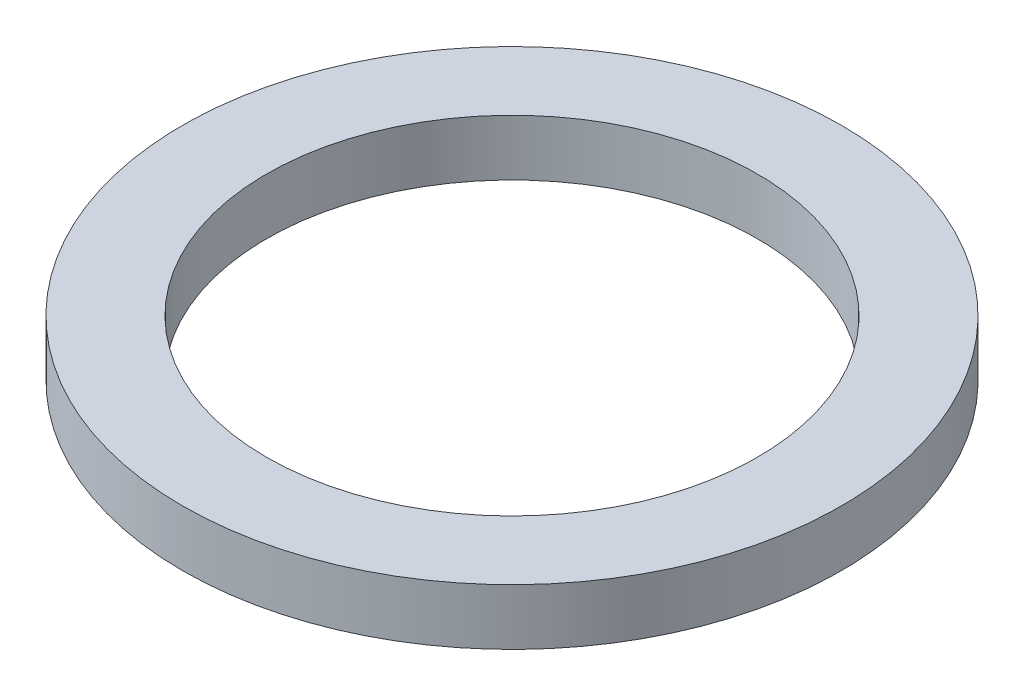
ISO-10303-21;
HEADER;
FILE_DESCRIPTION(('STEP AP214'),'2;1');
FILE_NAME('part.step','',(''),(''),'','','');
FILE_SCHEMA(('AUTOMOTIVE_DESIGN { 1 0 10303 214 1 1 1 1 }'));
ENDSEC;
DATA;
#1=APPLICATION_CONTEXT('core data for automotive mechanical design processes');
#2=APPLICATION_PROTOCOL_DEFINITION('international standard','automotive_design',2000,#1);
#3=PRODUCT_CONTEXT('',#1,'mechanical');
#4=PRODUCT('Part','Part','',(#3));
#5=PRODUCT_RELATED_PRODUCT_CATEGORY('part','',(#4));
#6=PRODUCT_DEFINITION_FORMATION('','',#4);
#7=PRODUCT_DEFINITION_CONTEXT('part definition',#1,'design');
#8=PRODUCT_DEFINITION('design','',#6,#7);
#9=PRODUCT_DEFINITION_SHAPE('','',#8);
#10=(LENGTH_UNIT() NAMED_UNIT(*) SI_UNIT(.MILLI.,.METRE.));
#11=(NAMED_UNIT(*) PLANE_ANGLE_UNIT() SI_UNIT($,.RADIAN.));
#12=(NAMED_UNIT(*) SI_UNIT($,.STERADIAN.) SOLID_ANGLE_UNIT());
#13=UNCERTAINTY_MEASURE_WITH_UNIT(LENGTH_MEASURE(1.E-05),#10,'distance_accuracy_value','');
#14=(GEOMETRIC_REPRESENTATION_CONTEXT(3) GLOBAL_UNCERTAINTY_ASSIGNED_CONTEXT((#13)) GLOBAL_UNIT_ASSIGNED_CONTEXT((#10,
#11,#12)) REPRESENTATION_CONTEXT('',''));
#15=CARTESIAN_POINT('',(0.,0.,0.));
#16=DIRECTION('',(0.,0.,1.));
#17=DIRECTION('',(1.,0.,0.));
#18=AXIS2_PLACEMENT_3D('',#15,#16,#17);
#19=CARTESIAN_POINT('',(0.,4.,0.));
#20=DIRECTION('',(0.,1.,0.));
#21=DIRECTION('',(0.,0.,1.));
#22=AXIS2_PLACEMENT_3D('',#19,#20,#21);
#23=PLANE('',#22);
#24=CARTESIAN_POINT('',(0.,4.,0.));
#25=DIRECTION('',(0.,1.,0.));
#26=DIRECTION('',(0.,0.,1.));
#27=AXIS2_PLACEMENT_3D('',#24,#25,#26);
#28=CIRCLE('',#27,23.5);
#29=CARTESIAN_POINT('',(0.,4.,23.5));
#30=VERTEX_POINT('',#29);
#31=EDGE_CURVE('E10',#30,#30,#28,.T.);
#32=ORIENTED_EDGE('',*,*,#31,.T.);
#33=EDGE_LOOP('',(#32));
#34=FACE_BOUND('',#33,.T.);
#35=CARTESIAN_POINT('',(0.,4.,0.));
#36=DIRECTION('',(0.,1.,0.));
#37=DIRECTION('',(0.,0.,1.));
#38=AXIS2_PLACEMENT_3D('',#35,#36,#37);
#39=CIRCLE('',#38,17.5);
#40=CARTESIAN_POINT('',(0.,4.,17.5));
#41=VERTEX_POINT('',#40);
#42=EDGE_CURVE('E44',#41,#41,#39,.T.);
#43=ORIENTED_EDGE('',*,*,#42,.F.);
#44=EDGE_LOOP('',(#43));
#45=FACE_BOUND('',#44,.T.);
#46=ADVANCED_FACE('F33',(#34,#45),#23,.T.);
#47=CARTESIAN_POINT('',(0.,0.,0.));
#48=DIRECTION('',(0.,1.,0.));
#49=DIRECTION('',(0.,0.,1.));
#50=AXIS2_PLACEMENT_3D('',#47,#48,#49);
#51=PLANE('',#50);
#52=CARTESIAN_POINT('',(0.,0.,0.));
#53=DIRECTION('',(0.,1.,0.));
#54=DIRECTION('',(0.,0.,1.));
#55=AXIS2_PLACEMENT_3D('',#52,#53,#54);
#56=CIRCLE('',#55,23.5);
#57=CARTESIAN_POINT('',(0.,0.,23.5));
#58=VERTEX_POINT('',#57);
#59=EDGE_CURVE('E37',#58,#58,#56,.T.);
#60=ORIENTED_EDGE('',*,*,#59,.F.);
#61=EDGE_LOOP('',(#60));
#62=FACE_BOUND('',#61,.T.);
#63=CARTESIAN_POINT('',(0.,0.,0.));
#64=DIRECTION('',(0.,1.,0.));
#65=DIRECTION('',(0.,0.,1.));
#66=AXIS2_PLACEMENT_3D('',#63,#64,#65);
#67=CIRCLE('',#66,17.5);
#68=CARTESIAN_POINT('',(0.,0.,17.5));
#69=VERTEX_POINT('',#68);
#70=EDGE_CURVE('E46',#69,#69,#67,.T.);
#71=ORIENTED_EDGE('',*,*,#70,.T.);
#72=EDGE_LOOP('',(#71));
#73=FACE_BOUND('',#72,.T.);
#74=ADVANCED_FACE('F56',(#62,#73),#51,.F.);
#75=CARTESIAN_POINT('',(0.,4.,0.));
#76=DIRECTION('',(0.,-1.,0.));
#77=DIRECTION('',(0.,0.,-1.));
#78=AXIS2_PLACEMENT_3D('',#75,#76,#77);
#79=CYLINDRICAL_SURFACE('',#78,23.5);
#80=ORIENTED_EDGE('',*,*,#31,.F.);
#81=EDGE_LOOP('',(#80));
#82=FACE_BOUND('',#81,.T.);
#83=ORIENTED_EDGE('',*,*,#59,.T.);
#84=EDGE_LOOP('',(#83));
#85=FACE_BOUND('',#84,.T.);
#86=ADVANCED_FACE('F35',(#82,#85),#79,.T.);
#87=CARTESIAN_POINT('',(0.,4.,0.));
#88=DIRECTION('',(0.,-1.,0.));
#89=DIRECTION('',(0.,0.,-1.));
#90=AXIS2_PLACEMENT_3D('',#87,#88,#89);
#91=CYLINDRICAL_SURFACE('',#90,17.5);
#92=ORIENTED_EDGE('',*,*,#42,.T.);
#93=EDGE_LOOP('',(#92));
#94=FACE_BOUND('',#93,.T.);
#95=ORIENTED_EDGE('',*,*,#70,.F.);
#96=EDGE_LOOP('',(#95));
#97=FACE_BOUND('',#96,.T.);
#98=ADVANCED_FACE('F52',(#94,#97),#91,.F.);
#99=CLOSED_SHELL('',(#46,#74,#86,#98));
#100=MANIFOLD_SOLID_BREP('B2',#99);
#101=ADVANCED_BREP_SHAPE_REPRESENTATION('',(#18,#100),#14);
#102=SHAPE_DEFINITION_REPRESENTATION(#9,#101);
ENDSEC;
END-ISO-10303-21;
